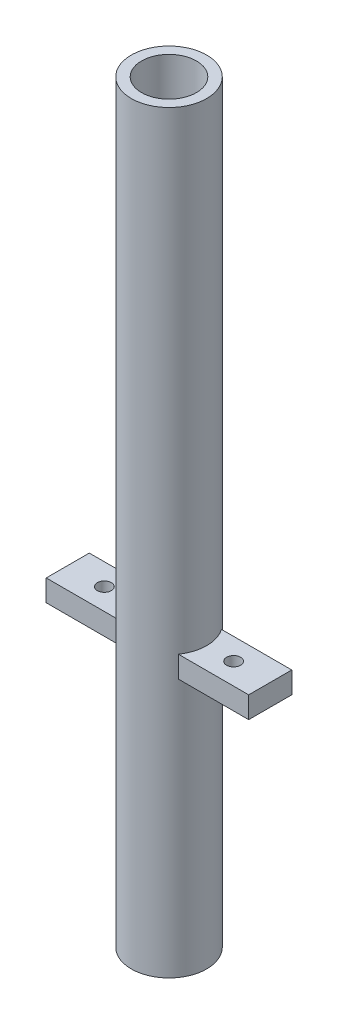
ISO-10303-21;
HEADER;
FILE_DESCRIPTION(('STEP AP214'),'2;1');
FILE_NAME('part.step','',(''),(''),'','','');
FILE_SCHEMA(('AUTOMOTIVE_DESIGN { 1 0 10303 214 1 1 1 1 }'));
ENDSEC;
DATA;
#1=APPLICATION_CONTEXT('core data for automotive mechanical design processes');
#2=APPLICATION_PROTOCOL_DEFINITION('international standard','automotive_design',2000,#1);
#3=PRODUCT_CONTEXT('',#1,'mechanical');
#4=PRODUCT('Part','Part','',(#3));
#5=PRODUCT_RELATED_PRODUCT_CATEGORY('part','',(#4));
#6=PRODUCT_DEFINITION_FORMATION('','',#4);
#7=PRODUCT_DEFINITION_CONTEXT('part definition',#1,'design');
#8=PRODUCT_DEFINITION('design','',#6,#7);
#9=PRODUCT_DEFINITION_SHAPE('','',#8);
#10=(LENGTH_UNIT() NAMED_UNIT(*) SI_UNIT(.MILLI.,.METRE.));
#11=(NAMED_UNIT(*) PLANE_ANGLE_UNIT() SI_UNIT($,.RADIAN.));
#12=(NAMED_UNIT(*) SI_UNIT($,.STERADIAN.) SOLID_ANGLE_UNIT());
#13=UNCERTAINTY_MEASURE_WITH_UNIT(LENGTH_MEASURE(1.E-05),#10,'distance_accuracy_value','');
#14=(GEOMETRIC_REPRESENTATION_CONTEXT(3) GLOBAL_UNCERTAINTY_ASSIGNED_CONTEXT((#13)) GLOBAL_UNIT_ASSIGNED_CONTEXT((#10,
#11,#12)) REPRESENTATION_CONTEXT('',''));
#15=CARTESIAN_POINT('',(0.,0.,0.));
#16=DIRECTION('',(0.,0.,1.));
#17=DIRECTION('',(1.,0.,0.));
#18=AXIS2_PLACEMENT_3D('',#15,#16,#17);
#19=CARTESIAN_POINT('',(0.,175.,0.));
#20=DIRECTION('',(0.,-1.,0.));
#21=DIRECTION('',(0.,0.,-1.));
#22=AXIS2_PLACEMENT_3D('',#19,#20,#21);
#23=CYLINDRICAL_SURFACE('',#22,17.5);
#24=DIRECTION('',(0.,-1.,0.));
#25=VECTOR('',#24,1.);
#26=CARTESIAN_POINT('',(-14.3614066163451,175.,-10.));
#27=LINE('',#26,#25);
#28=CARTESIAN_POINT('',(-14.3614066163451,-55.,-10.));
#29=VERTEX_POINT('',#28);
#30=CARTESIAN_POINT('',(-14.3614066163451,-45.,-10.));
#31=VERTEX_POINT('',#30);
#32=EDGE_CURVE('E52',#29,#31,#27,.F.);
#33=ORIENTED_EDGE('',*,*,#32,.T.);
#34=CARTESIAN_POINT('',(0.,-45.,0.));
#35=DIRECTION('',(0.,1.,0.));
#36=DIRECTION('',(0.,0.,1.));
#37=AXIS2_PLACEMENT_3D('',#34,#35,#36);
#38=CIRCLE('',#37,17.5);
#39=CARTESIAN_POINT('',(-14.3614066163451,-45.,9.99999999999999));
#40=VERTEX_POINT('',#39);
#41=EDGE_CURVE('E47',#31,#40,#38,.T.);
#42=ORIENTED_EDGE('',*,*,#41,.T.);
#43=DIRECTION('',(0.,-1.,0.));
#44=VECTOR('',#43,1.);
#45=CARTESIAN_POINT('',(-14.3614066163451,175.,9.99999999999999));
#46=LINE('',#45,#44);
#47=CARTESIAN_POINT('',(-14.3614066163451,-55.,9.99999999999999));
#48=VERTEX_POINT('',#47);
#49=EDGE_CURVE('E135',#40,#48,#46,.T.);
#50=ORIENTED_EDGE('',*,*,#49,.T.);
#51=CARTESIAN_POINT('',(0.,-55.,0.));
#52=DIRECTION('',(0.,1.,0.));
#53=DIRECTION('',(0.,0.,1.));
#54=AXIS2_PLACEMENT_3D('',#51,#52,#53);
#55=CIRCLE('',#54,17.5);
#56=EDGE_CURVE('E129',#29,#48,#55,.T.);
#57=ORIENTED_EDGE('',*,*,#56,.F.);
#58=EDGE_LOOP('',(#33,#42,#50,#57));
#59=FACE_BOUND('',#58,.T.);
#60=CARTESIAN_POINT('',(0.,-175.,0.));
#61=DIRECTION('',(0.,1.,0.));
#62=DIRECTION('',(0.,0.,1.));
#63=AXIS2_PLACEMENT_3D('',#60,#61,#62);
#64=CIRCLE('',#63,17.5);
#65=CARTESIAN_POINT('',(0.,-175.,17.5));
#66=VERTEX_POINT('',#65);
#67=EDGE_CURVE('E36',#66,#66,#64,.T.);
#68=ORIENTED_EDGE('',*,*,#67,.T.);
#69=EDGE_LOOP('',(#68));
#70=FACE_BOUND('',#69,.T.);
#71=CARTESIAN_POINT('',(0.,175.,0.));
#72=DIRECTION('',(0.,1.,0.));
#73=DIRECTION('',(0.,0.,1.));
#74=AXIS2_PLACEMENT_3D('',#71,#72,#73);
#75=CIRCLE('',#74,17.5);
#76=CARTESIAN_POINT('',(0.,175.,17.5));
#77=VERTEX_POINT('',#76);
#78=EDGE_CURVE('E11',#77,#77,#75,.T.);
#79=ORIENTED_EDGE('',*,*,#78,.F.);
#80=EDGE_LOOP('',(#79));
#81=FACE_BOUND('',#80,.T.);
#82=CARTESIAN_POINT('',(0.,-45.,0.));
#83=DIRECTION('',(0.,-1.,0.));
#84=DIRECTION('',(0.,0.,-1.));
#85=AXIS2_PLACEMENT_3D('',#82,#83,#84);
#86=CIRCLE('',#85,17.5);
#87=CARTESIAN_POINT('',(14.3614066163451,-45.,-10.));
#88=VERTEX_POINT('',#87);
#89=CARTESIAN_POINT('',(14.3614066163451,-45.,10.));
#90=VERTEX_POINT('',#89);
#91=EDGE_CURVE('E166',#88,#90,#86,.T.);
#92=ORIENTED_EDGE('',*,*,#91,.F.);
#93=DIRECTION('',(0.,-1.,0.));
#94=VECTOR('',#93,1.);
#95=CARTESIAN_POINT('',(14.3614066163451,175.,-10.));
#96=LINE('',#95,#94);
#97=CARTESIAN_POINT('',(14.3614066163451,-55.,-10.));
#98=VERTEX_POINT('',#97);
#99=EDGE_CURVE('E171',#88,#98,#96,.T.);
#100=ORIENTED_EDGE('',*,*,#99,.T.);
#101=CARTESIAN_POINT('',(0.,-55.,0.));
#102=DIRECTION('',(0.,-1.,0.));
#103=DIRECTION('',(0.,0.,-1.));
#104=AXIS2_PLACEMENT_3D('',#101,#102,#103);
#105=CIRCLE('',#104,17.5);
#106=CARTESIAN_POINT('',(14.3614066163451,-55.,10.));
#107=VERTEX_POINT('',#106);
#108=EDGE_CURVE('E161',#98,#107,#105,.T.);
#109=ORIENTED_EDGE('',*,*,#108,.T.);
#110=DIRECTION('',(0.,-1.,0.));
#111=VECTOR('',#110,1.);
#112=CARTESIAN_POINT('',(14.3614066163451,175.,10.));
#113=LINE('',#112,#111);
#114=EDGE_CURVE('E168',#107,#90,#113,.F.);
#115=ORIENTED_EDGE('',*,*,#114,.T.);
#116=EDGE_LOOP('',(#92,#100,#109,#115));
#117=FACE_BOUND('',#116,.T.);
#118=ADVANCED_FACE('F33',(#59,#70,#81,#117),#23,.T.);
#119=CARTESIAN_POINT('',(0.,175.,0.));
#120=DIRECTION('',(0.,1.,0.));
#121=DIRECTION('',(0.,0.,1.));
#122=AXIS2_PLACEMENT_3D('',#119,#120,#121);
#123=PLANE('',#122);
#124=ORIENTED_EDGE('',*,*,#78,.T.);
#125=EDGE_LOOP('',(#124));
#126=FACE_BOUND('',#125,.T.);
#127=CARTESIAN_POINT('',(0.,175.,0.));
#128=DIRECTION('',(0.,1.,0.));
#129=DIRECTION('',(0.,0.,1.));
#130=AXIS2_PLACEMENT_3D('',#127,#128,#129);
#131=CIRCLE('',#130,12.75);
#132=CARTESIAN_POINT('',(0.,175.,12.75));
#133=VERTEX_POINT('',#132);
#134=EDGE_CURVE('E175',#133,#133,#131,.T.);
#135=ORIENTED_EDGE('',*,*,#134,.F.);
#136=EDGE_LOOP('',(#135));
#137=FACE_BOUND('',#136,.T.);
#138=ADVANCED_FACE('F195',(#126,#137),#123,.T.);
#139=CARTESIAN_POINT('',(0.,-175.,0.));
#140=DIRECTION('',(0.,1.,0.));
#141=DIRECTION('',(0.,0.,1.));
#142=AXIS2_PLACEMENT_3D('',#139,#140,#141);
#143=PLANE('',#142);
#144=ORIENTED_EDGE('',*,*,#67,.F.);
#145=EDGE_LOOP('',(#144));
#146=FACE_BOUND('',#145,.T.);
#147=CARTESIAN_POINT('',(0.,-175.,0.));
#148=DIRECTION('',(0.,1.,0.));
#149=DIRECTION('',(0.,0.,1.));
#150=AXIS2_PLACEMENT_3D('',#147,#148,#149);
#151=CIRCLE('',#150,12.75);
#152=CARTESIAN_POINT('',(0.,-175.,12.75));
#153=VERTEX_POINT('',#152);
#154=EDGE_CURVE('E174',#153,#153,#151,.T.);
#155=ORIENTED_EDGE('',*,*,#154,.T.);
#156=EDGE_LOOP('',(#155));
#157=FACE_BOUND('',#156,.T.);
#158=ADVANCED_FACE('F181',(#146,#157),#143,.F.);
#159=CARTESIAN_POINT('',(0.,175.,0.));
#160=DIRECTION('',(0.,-1.,0.));
#161=DIRECTION('',(0.,0.,-1.));
#162=AXIS2_PLACEMENT_3D('',#159,#160,#161);
#163=CYLINDRICAL_SURFACE('',#162,12.75);
#164=ORIENTED_EDGE('',*,*,#134,.T.);
#165=EDGE_LOOP('',(#164));
#166=FACE_BOUND('',#165,.T.);
#167=ORIENTED_EDGE('',*,*,#154,.F.);
#168=EDGE_LOOP('',(#167));
#169=FACE_BOUND('',#168,.T.);
#170=ADVANCED_FACE('F183',(#166,#169),#163,.F.);
#171=CARTESIAN_POINT('',(7.90964600977818,-45.,-10.));
#172=DIRECTION('',(0.,0.,-1.));
#173=DIRECTION('',(-1.,0.,0.));
#174=AXIS2_PLACEMENT_3D('',#171,#172,#173);
#175=PLANE('',#174);
#176=ORIENTED_EDGE('',*,*,#99,.F.);
#177=DIRECTION('',(1.,0.,0.));
#178=VECTOR('',#177,1.);
#179=CARTESIAN_POINT('',(7.90964600977818,-45.,-10.));
#180=LINE('',#179,#178);
#181=CARTESIAN_POINT('',(47.,-45.,-10.));
#182=VERTEX_POINT('',#181);
#183=EDGE_CURVE('E144',#88,#182,#180,.T.);
#184=ORIENTED_EDGE('',*,*,#183,.T.);
#185=DIRECTION('',(0.,-1.,0.));
#186=VECTOR('',#185,1.);
#187=CARTESIAN_POINT('',(47.,-45.,-10.));
#188=LINE('',#187,#186);
#189=CARTESIAN_POINT('',(47.,-55.,-10.));
#190=VERTEX_POINT('',#189);
#191=EDGE_CURVE('E153',#182,#190,#188,.T.);
#192=ORIENTED_EDGE('',*,*,#191,.T.);
#193=DIRECTION('',(1.,0.,0.));
#194=VECTOR('',#193,1.);
#195=CARTESIAN_POINT('',(7.90964600977818,-55.,-10.));
#196=LINE('',#195,#194);
#197=EDGE_CURVE('E141',#98,#190,#196,.T.);
#198=ORIENTED_EDGE('',*,*,#197,.F.);
#199=EDGE_LOOP('',(#176,#184,#192,#198));
#200=FACE_BOUND('',#199,.T.);
#201=ADVANCED_FACE('F185',(#200),#175,.T.);
#202=CARTESIAN_POINT('',(7.90964600977819,-45.,10.));
#203=DIRECTION('',(0.,0.,1.));
#204=DIRECTION('',(1.,0.,0.));
#205=AXIS2_PLACEMENT_3D('',#202,#203,#204);
#206=PLANE('',#205);
#207=ORIENTED_EDGE('',*,*,#114,.F.);
#208=DIRECTION('',(-1.,0.,0.));
#209=VECTOR('',#208,1.);
#210=CARTESIAN_POINT('',(7.90964600977819,-55.,10.));
#211=LINE('',#210,#209);
#212=CARTESIAN_POINT('',(47.,-55.,10.));
#213=VERTEX_POINT('',#212);
#214=EDGE_CURVE('E147',#213,#107,#211,.T.);
#215=ORIENTED_EDGE('',*,*,#214,.F.);
#216=DIRECTION('',(0.,-1.,0.));
#217=VECTOR('',#216,1.);
#218=CARTESIAN_POINT('',(47.,-45.,10.));
#219=LINE('',#218,#217);
#220=CARTESIAN_POINT('',(47.,-45.,10.));
#221=VERTEX_POINT('',#220);
#222=EDGE_CURVE('E159',#221,#213,#219,.T.);
#223=ORIENTED_EDGE('',*,*,#222,.F.);
#224=DIRECTION('',(-1.,0.,0.));
#225=VECTOR('',#224,1.);
#226=CARTESIAN_POINT('',(7.90964600977819,-45.,10.));
#227=LINE('',#226,#225);
#228=EDGE_CURVE('E150',#221,#90,#227,.T.);
#229=ORIENTED_EDGE('',*,*,#228,.T.);
#230=EDGE_LOOP('',(#207,#215,#223,#229));
#231=FACE_BOUND('',#230,.T.);
#232=ADVANCED_FACE('F192',(#231),#206,.T.);
#233=CARTESIAN_POINT('',(0.,-45.,0.));
#234=DIRECTION('',(0.,-1.,0.));
#235=DIRECTION('',(0.,0.,-1.));
#236=AXIS2_PLACEMENT_3D('',#233,#234,#235);
#237=PLANE('',#236);
#238=CARTESIAN_POINT('',(30.,-45.,0.));
#239=DIRECTION('',(0.,-1.,0.));
#240=DIRECTION('',(0.,0.,-1.));
#241=AXIS2_PLACEMENT_3D('',#238,#239,#240);
#242=CIRCLE('',#241,3.25);
#243=CARTESIAN_POINT('',(30.,-45.,-3.25));
#244=VERTEX_POINT('',#243);
#245=EDGE_CURVE('E138',#244,#244,#242,.T.);
#246=ORIENTED_EDGE('',*,*,#245,.T.);
#247=EDGE_LOOP('',(#246));
#248=FACE_BOUND('',#247,.T.);
#249=ORIENTED_EDGE('',*,*,#183,.F.);
#250=ORIENTED_EDGE('',*,*,#91,.T.);
#251=ORIENTED_EDGE('',*,*,#228,.F.);
#252=DIRECTION('',(0.,0.,1.));
#253=VECTOR('',#252,1.);
#254=CARTESIAN_POINT('',(47.,-45.,10.));
#255=LINE('',#254,#253);
#256=EDGE_CURVE('E146',#182,#221,#255,.T.);
#257=ORIENTED_EDGE('',*,*,#256,.F.);
#258=EDGE_LOOP('',(#249,#250,#251,#257));
#259=FACE_BOUND('',#258,.T.);
#260=ADVANCED_FACE('F214',(#248,#259),#237,.F.);
#261=CARTESIAN_POINT('',(0.,-55.,0.));
#262=DIRECTION('',(0.,-1.,0.));
#263=DIRECTION('',(0.,0.,-1.));
#264=AXIS2_PLACEMENT_3D('',#261,#262,#263);
#265=PLANE('',#264);
#266=CARTESIAN_POINT('',(30.,-55.,0.));
#267=DIRECTION('',(0.,-1.,0.));
#268=DIRECTION('',(0.,0.,-1.));
#269=AXIS2_PLACEMENT_3D('',#266,#267,#268);
#270=CIRCLE('',#269,3.25);
#271=CARTESIAN_POINT('',(30.,-55.,-3.25));
#272=VERTEX_POINT('',#271);
#273=EDGE_CURVE('E137',#272,#272,#270,.T.);
#274=ORIENTED_EDGE('',*,*,#273,.F.);
#275=EDGE_LOOP('',(#274));
#276=FACE_BOUND('',#275,.T.);
#277=ORIENTED_EDGE('',*,*,#108,.F.);
#278=ORIENTED_EDGE('',*,*,#197,.T.);
#279=DIRECTION('',(0.,0.,1.));
#280=VECTOR('',#279,1.);
#281=CARTESIAN_POINT('',(47.,-55.,10.));
#282=LINE('',#281,#280);
#283=EDGE_CURVE('E155',#190,#213,#282,.T.);
#284=ORIENTED_EDGE('',*,*,#283,.T.);
#285=ORIENTED_EDGE('',*,*,#214,.T.);
#286=EDGE_LOOP('',(#277,#278,#284,#285));
#287=FACE_BOUND('',#286,.T.);
#288=ADVANCED_FACE('F224',(#276,#287),#265,.T.);
#289=CARTESIAN_POINT('',(47.,-45.,10.));
#290=DIRECTION('',(1.,0.,0.));
#291=DIRECTION('',(0.,0.,-1.));
#292=AXIS2_PLACEMENT_3D('',#289,#290,#291);
#293=PLANE('',#292);
#294=ORIENTED_EDGE('',*,*,#283,.F.);
#295=ORIENTED_EDGE('',*,*,#191,.F.);
#296=ORIENTED_EDGE('',*,*,#256,.T.);
#297=ORIENTED_EDGE('',*,*,#222,.T.);
#298=EDGE_LOOP('',(#294,#295,#296,#297));
#299=FACE_BOUND('',#298,.T.);
#300=ADVANCED_FACE('F220',(#299),#293,.T.);
#301=CARTESIAN_POINT('',(30.,-45.,0.));
#302=DIRECTION('',(0.,-1.,0.));
#303=DIRECTION('',(0.,0.,-1.));
#304=AXIS2_PLACEMENT_3D('',#301,#302,#303);
#305=CYLINDRICAL_SURFACE('',#304,3.25);
#306=ORIENTED_EDGE('',*,*,#245,.F.);
#307=EDGE_LOOP('',(#306));
#308=FACE_BOUND('',#307,.T.);
#309=ORIENTED_EDGE('',*,*,#273,.T.);
#310=EDGE_LOOP('',(#309));
#311=FACE_BOUND('',#310,.T.);
#312=ADVANCED_FACE('F232',(#308,#311),#305,.F.);
#313=CARTESIAN_POINT('',(-47.,-45.,9.99999999999999));
#314=DIRECTION('',(0.,0.,1.));
#315=DIRECTION('',(1.,0.,0.));
#316=AXIS2_PLACEMENT_3D('',#313,#314,#315);
#317=PLANE('',#316);
#318=ORIENTED_EDGE('',*,*,#49,.F.);
#319=DIRECTION('',(-1.,0.,0.));
#320=VECTOR('',#319,1.);
#321=CARTESIAN_POINT('',(-47.,-45.,9.99999999999999));
#322=LINE('',#321,#320);
#323=CARTESIAN_POINT('',(-47.,-45.,9.99999999999999));
#324=VERTEX_POINT('',#323);
#325=EDGE_CURVE('E106',#40,#324,#322,.T.);
#326=ORIENTED_EDGE('',*,*,#325,.T.);
#327=DIRECTION('',(0.,-1.,0.));
#328=VECTOR('',#327,1.);
#329=CARTESIAN_POINT('',(-47.,-45.,9.99999999999999));
#330=LINE('',#329,#328);
#331=CARTESIAN_POINT('',(-47.,-55.,9.99999999999999));
#332=VERTEX_POINT('',#331);
#333=EDGE_CURVE('E105',#324,#332,#330,.T.);
#334=ORIENTED_EDGE('',*,*,#333,.T.);
#335=DIRECTION('',(-1.,0.,0.));
#336=VECTOR('',#335,1.);
#337=CARTESIAN_POINT('',(-47.,-55.,9.99999999999999));
#338=LINE('',#337,#336);
#339=EDGE_CURVE('E117',#48,#332,#338,.T.);
#340=ORIENTED_EDGE('',*,*,#339,.F.);
#341=EDGE_LOOP('',(#318,#326,#334,#340));
#342=FACE_BOUND('',#341,.T.);
#343=ADVANCED_FACE('F269',(#342),#317,.T.);
#344=CARTESIAN_POINT('',(-47.,-45.,-10.));
#345=DIRECTION('',(0.,0.,-1.));
#346=DIRECTION('',(-1.,0.,0.));
#347=AXIS2_PLACEMENT_3D('',#344,#345,#346);
#348=PLANE('',#347);
#349=ORIENTED_EDGE('',*,*,#32,.F.);
#350=DIRECTION('',(1.,0.,0.));
#351=VECTOR('',#350,1.);
#352=CARTESIAN_POINT('',(-47.,-55.,-10.));
#353=LINE('',#352,#351);
#354=CARTESIAN_POINT('',(-47.,-55.,-10.));
#355=VERTEX_POINT('',#354);
#356=EDGE_CURVE('E100',#355,#29,#353,.T.);
#357=ORIENTED_EDGE('',*,*,#356,.F.);
#358=DIRECTION('',(0.,-1.,0.));
#359=VECTOR('',#358,1.);
#360=CARTESIAN_POINT('',(-47.,-45.,-10.));
#361=LINE('',#360,#359);
#362=CARTESIAN_POINT('',(-47.,-45.,-10.));
#363=VERTEX_POINT('',#362);
#364=EDGE_CURVE('E95',#363,#355,#361,.T.);
#365=ORIENTED_EDGE('',*,*,#364,.F.);
#366=DIRECTION('',(1.,0.,0.));
#367=VECTOR('',#366,1.);
#368=CARTESIAN_POINT('',(-47.,-45.,-10.));
#369=LINE('',#368,#367);
#370=EDGE_CURVE('E98',#363,#31,#369,.T.);
#371=ORIENTED_EDGE('',*,*,#370,.T.);
#372=EDGE_LOOP('',(#349,#357,#365,#371));
#373=FACE_BOUND('',#372,.T.);
#374=ADVANCED_FACE('F97',(#373),#348,.T.);
#375=CARTESIAN_POINT('',(0.,-45.,0.));
#376=DIRECTION('',(0.,1.,0.));
#377=DIRECTION('',(0.,0.,1.));
#378=AXIS2_PLACEMENT_3D('',#375,#376,#377);
#379=PLANE('',#378);
#380=CARTESIAN_POINT('',(-30.,-45.,0.));
#381=DIRECTION('',(0.,-1.,0.));
#382=DIRECTION('',(0.,0.,1.));
#383=AXIS2_PLACEMENT_3D('',#380,#381,#382);
#384=CIRCLE('',#383,3.25);
#385=CARTESIAN_POINT('',(-30.,-45.,3.25));
#386=VERTEX_POINT('',#385);
#387=EDGE_CURVE('E127',#386,#386,#384,.T.);
#388=ORIENTED_EDGE('',*,*,#387,.T.);
#389=EDGE_LOOP('',(#388));
#390=FACE_BOUND('',#389,.T.);
#391=ORIENTED_EDGE('',*,*,#41,.F.);
#392=ORIENTED_EDGE('',*,*,#370,.F.);
#393=DIRECTION('',(0.,0.,-1.));
#394=VECTOR('',#393,1.);
#395=CARTESIAN_POINT('',(-47.,-45.,9.99999999999999));
#396=LINE('',#395,#394);
#397=EDGE_CURVE('E112',#324,#363,#396,.T.);
#398=ORIENTED_EDGE('',*,*,#397,.F.);
#399=ORIENTED_EDGE('',*,*,#325,.F.);
#400=EDGE_LOOP('',(#391,#392,#398,#399));
#401=FACE_BOUND('',#400,.T.);
#402=ADVANCED_FACE('F110',(#390,#401),#379,.T.);
#403=CARTESIAN_POINT('',(0.,-55.,0.));
#404=DIRECTION('',(0.,1.,0.));
#405=DIRECTION('',(0.,0.,1.));
#406=AXIS2_PLACEMENT_3D('',#403,#404,#405);
#407=PLANE('',#406);
#408=CARTESIAN_POINT('',(-30.,-55.,0.));
#409=DIRECTION('',(0.,-1.,0.));
#410=DIRECTION('',(0.,0.,1.));
#411=AXIS2_PLACEMENT_3D('',#408,#409,#410);
#412=CIRCLE('',#411,3.25);
#413=CARTESIAN_POINT('',(-30.,-55.,3.25));
#414=VERTEX_POINT('',#413);
#415=EDGE_CURVE('E121',#414,#414,#412,.T.);
#416=ORIENTED_EDGE('',*,*,#415,.F.);
#417=EDGE_LOOP('',(#416));
#418=FACE_BOUND('',#417,.T.);
#419=ORIENTED_EDGE('',*,*,#356,.T.);
#420=ORIENTED_EDGE('',*,*,#56,.T.);
#421=ORIENTED_EDGE('',*,*,#339,.T.);
#422=DIRECTION('',(0.,0.,-1.));
#423=VECTOR('',#422,1.);
#424=CARTESIAN_POINT('',(-47.,-55.,9.99999999999999));
#425=LINE('',#424,#423);
#426=EDGE_CURVE('E125',#332,#355,#425,.T.);
#427=ORIENTED_EDGE('',*,*,#426,.T.);
#428=EDGE_LOOP('',(#419,#420,#421,#427));
#429=FACE_BOUND('',#428,.T.);
#430=ADVANCED_FACE('F295',(#418,#429),#407,.F.);
#431=CARTESIAN_POINT('',(-47.,-45.,9.99999999999999));
#432=DIRECTION('',(-1.,0.,0.));
#433=DIRECTION('',(0.,0.,1.));
#434=AXIS2_PLACEMENT_3D('',#431,#432,#433);
#435=PLANE('',#434);
#436=ORIENTED_EDGE('',*,*,#426,.F.);
#437=ORIENTED_EDGE('',*,*,#333,.F.);
#438=ORIENTED_EDGE('',*,*,#397,.T.);
#439=ORIENTED_EDGE('',*,*,#364,.T.);
#440=EDGE_LOOP('',(#436,#437,#438,#439));
#441=FACE_BOUND('',#440,.T.);
#442=ADVANCED_FACE('F115',(#441),#435,.T.);
#443=CARTESIAN_POINT('',(-30.,-45.,0.));
#444=DIRECTION('',(0.,-1.,0.));
#445=DIRECTION('',(0.,0.,-1.));
#446=AXIS2_PLACEMENT_3D('',#443,#444,#445);
#447=CYLINDRICAL_SURFACE('',#446,3.25);
#448=ORIENTED_EDGE('',*,*,#387,.F.);
#449=EDGE_LOOP('',(#448));
#450=FACE_BOUND('',#449,.T.);
#451=ORIENTED_EDGE('',*,*,#415,.T.);
#452=EDGE_LOOP('',(#451));
#453=FACE_BOUND('',#452,.T.);
#454=ADVANCED_FACE('F314',(#450,#453),#447,.F.);
#455=CLOSED_SHELL('',(#118,#138,#158,#170,#201,#232,#260,#288,#300,#312,#343,#374,#402,#430,
#442,#454));
#456=MANIFOLD_SOLID_BREP('B2',#455);
#457=ADVANCED_BREP_SHAPE_REPRESENTATION('',(#18,#456),#14);
#458=SHAPE_DEFINITION_REPRESENTATION(#9,#457);
ENDSEC;
END-ISO-10303-21;
